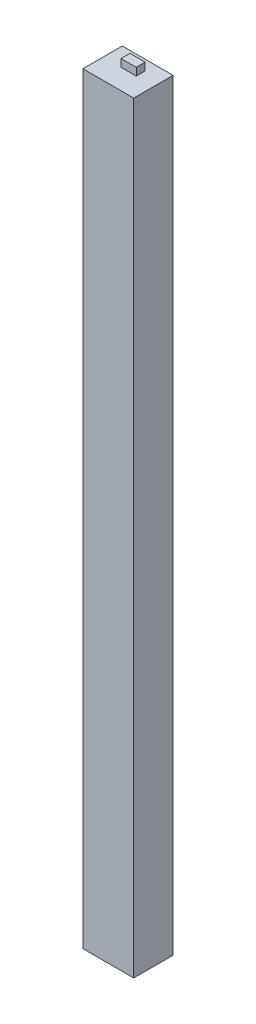
ISO-10303-21;
HEADER;
FILE_DESCRIPTION(('STEP AP214'),'2;1');
FILE_NAME('part.step','',(''),(''),'','','');
FILE_SCHEMA(('AUTOMOTIVE_DESIGN { 1 0 10303 214 1 1 1 1 }'));
ENDSEC;
DATA;
#1=APPLICATION_CONTEXT('core data for automotive mechanical design processes');
#2=APPLICATION_PROTOCOL_DEFINITION('international standard','automotive_design',2000,#1);
#3=PRODUCT_CONTEXT('',#1,'mechanical');
#4=PRODUCT('Part','Part','',(#3));
#5=PRODUCT_RELATED_PRODUCT_CATEGORY('part','',(#4));
#6=PRODUCT_DEFINITION_FORMATION('','',#4);
#7=PRODUCT_DEFINITION_CONTEXT('part definition',#1,'design');
#8=PRODUCT_DEFINITION('design','',#6,#7);
#9=PRODUCT_DEFINITION_SHAPE('','',#8);
#10=(LENGTH_UNIT() NAMED_UNIT(*) SI_UNIT(.MILLI.,.METRE.));
#11=(NAMED_UNIT(*) PLANE_ANGLE_UNIT() SI_UNIT($,.RADIAN.));
#12=(NAMED_UNIT(*) SI_UNIT($,.STERADIAN.) SOLID_ANGLE_UNIT());
#13=UNCERTAINTY_MEASURE_WITH_UNIT(LENGTH_MEASURE(1.E-05),#10,'distance_accuracy_value','');
#14=(GEOMETRIC_REPRESENTATION_CONTEXT(3) GLOBAL_UNCERTAINTY_ASSIGNED_CONTEXT((#13)) GLOBAL_UNIT_ASSIGNED_CONTEXT((#10,
#11,#12)) REPRESENTATION_CONTEXT('',''));
#15=CARTESIAN_POINT('',(0.,0.,0.));
#16=DIRECTION('',(0.,0.,1.));
#17=DIRECTION('',(1.,0.,0.));
#18=AXIS2_PLACEMENT_3D('',#15,#16,#17);
#19=CARTESIAN_POINT('',(-10.,150.,15.5));
#20=DIRECTION('',(0.,-1.,0.));
#21=DIRECTION('',(0.,0.,-1.));
#22=AXIS2_PLACEMENT_3D('',#19,#20,#21);
#23=PLANE('',#22);
#24=DIRECTION('',(-1.,0.,0.));
#25=VECTOR('',#24,1.);
#26=CARTESIAN_POINT('',(-10.,150.,0.));
#27=LINE('',#26,#25);
#28=CARTESIAN_POINT('',(10.,150.,0.));
#29=VERTEX_POINT('',#28);
#30=CARTESIAN_POINT('',(-10.,150.,0.));
#31=VERTEX_POINT('',#30);
#32=EDGE_CURVE('E123',#29,#31,#27,.T.);
#33=ORIENTED_EDGE('',*,*,#32,.T.);
#34=DIRECTION('',(0.,0.,-1.));
#35=VECTOR('',#34,1.);
#36=CARTESIAN_POINT('',(-10.,150.,15.5));
#37=LINE('',#36,#35);
#38=CARTESIAN_POINT('',(-10.,150.,15.5));
#39=VERTEX_POINT('',#38);
#40=EDGE_CURVE('E43',#39,#31,#37,.T.);
#41=ORIENTED_EDGE('',*,*,#40,.F.);
#42=DIRECTION('',(-1.,0.,0.));
#43=VECTOR('',#42,1.);
#44=CARTESIAN_POINT('',(-10.,150.,15.5));
#45=LINE('',#44,#43);
#46=CARTESIAN_POINT('',(10.,150.,15.5));
#47=VERTEX_POINT('',#46);
#48=EDGE_CURVE('E132',#47,#39,#45,.T.);
#49=ORIENTED_EDGE('',*,*,#48,.F.);
#50=DIRECTION('',(0.,0.,-1.));
#51=VECTOR('',#50,1.);
#52=CARTESIAN_POINT('',(10.,150.,15.5));
#53=LINE('',#52,#51);
#54=EDGE_CURVE('E11',#47,#29,#53,.T.);
#55=ORIENTED_EDGE('',*,*,#54,.T.);
#56=EDGE_LOOP('',(#33,#41,#49,#55));
#57=FACE_BOUND('',#56,.T.);
#58=DIRECTION('',(0.,0.,-1.));
#59=VECTOR('',#58,1.);
#60=CARTESIAN_POINT('',(3.,150.,4.));
#61=LINE('',#60,#59);
#62=CARTESIAN_POINT('',(3.,150.,7.5));
#63=VERTEX_POINT('',#62);
#64=CARTESIAN_POINT('',(3.,150.,4.));
#65=VERTEX_POINT('',#64);
#66=EDGE_CURVE('E50',#63,#65,#61,.T.);
#67=ORIENTED_EDGE('',*,*,#66,.F.);
#68=DIRECTION('',(1.,0.,0.));
#69=VECTOR('',#68,1.);
#70=CARTESIAN_POINT('',(-3.,150.,7.5));
#71=LINE('',#70,#69);
#72=CARTESIAN_POINT('',(-3.,150.,7.5));
#73=VERTEX_POINT('',#72);
#74=EDGE_CURVE('E54',#73,#63,#71,.T.);
#75=ORIENTED_EDGE('',*,*,#74,.F.);
#76=DIRECTION('',(0.,0.,1.));
#77=VECTOR('',#76,1.);
#78=CARTESIAN_POINT('',(-3.,150.,4.));
#79=LINE('',#78,#77);
#80=CARTESIAN_POINT('',(-3.,150.,4.));
#81=VERTEX_POINT('',#80);
#82=EDGE_CURVE('E262',#81,#73,#79,.T.);
#83=ORIENTED_EDGE('',*,*,#82,.F.);
#84=DIRECTION('',(-1.,0.,0.));
#85=VECTOR('',#84,1.);
#86=CARTESIAN_POINT('',(-3.,150.,4.));
#87=LINE('',#86,#85);
#88=EDGE_CURVE('E268',#65,#81,#87,.T.);
#89=ORIENTED_EDGE('',*,*,#88,.F.);
#90=EDGE_LOOP('',(#67,#75,#83,#89));
#91=FACE_BOUND('',#90,.T.);
#92=ADVANCED_FACE('F35',(#57,#91),#23,.F.);
#93=CARTESIAN_POINT('',(10.,150.,15.5));
#94=DIRECTION('',(-1.,0.,0.));
#95=DIRECTION('',(0.,-1.,0.));
#96=AXIS2_PLACEMENT_3D('',#93,#94,#95);
#97=PLANE('',#96);
#98=DIRECTION('',(0.,1.,0.));
#99=VECTOR('',#98,1.);
#100=CARTESIAN_POINT('',(10.,150.,0.));
#101=LINE('',#100,#99);
#102=CARTESIAN_POINT('',(10.,-150.,0.));
#103=VERTEX_POINT('',#102);
#104=EDGE_CURVE('E120',#103,#29,#101,.T.);
#105=ORIENTED_EDGE('',*,*,#104,.T.);
#106=ORIENTED_EDGE('',*,*,#54,.F.);
#107=DIRECTION('',(0.,1.,0.));
#108=VECTOR('',#107,1.);
#109=CARTESIAN_POINT('',(10.,150.,15.5));
#110=LINE('',#109,#108);
#111=CARTESIAN_POINT('',(10.,-150.,15.5));
#112=VERTEX_POINT('',#111);
#113=EDGE_CURVE('E129',#112,#47,#110,.T.);
#114=ORIENTED_EDGE('',*,*,#113,.F.);
#115=DIRECTION('',(0.,0.,-1.));
#116=VECTOR('',#115,1.);
#117=CARTESIAN_POINT('',(10.,-150.,15.5));
#118=LINE('',#117,#116);
#119=EDGE_CURVE('E138',#112,#103,#118,.T.);
#120=ORIENTED_EDGE('',*,*,#119,.T.);
#121=EDGE_LOOP('',(#105,#106,#114,#120));
#122=FACE_BOUND('',#121,.T.);
#123=ADVANCED_FACE('F37',(#122),#97,.F.);
#124=CARTESIAN_POINT('',(-10.,150.,15.5));
#125=DIRECTION('',(1.,0.,0.));
#126=DIRECTION('',(0.,1.,0.));
#127=AXIS2_PLACEMENT_3D('',#124,#125,#126);
#128=PLANE('',#127);
#129=DIRECTION('',(0.,-1.,0.));
#130=VECTOR('',#129,1.);
#131=CARTESIAN_POINT('',(-10.,150.,0.));
#132=LINE('',#131,#130);
#133=CARTESIAN_POINT('',(-9.99999999999997,-150.,0.));
#134=VERTEX_POINT('',#133);
#135=EDGE_CURVE('E141',#31,#134,#132,.T.);
#136=ORIENTED_EDGE('',*,*,#135,.T.);
#137=DIRECTION('',(0.,0.,-1.));
#138=VECTOR('',#137,1.);
#139=CARTESIAN_POINT('',(-9.99999999999997,-150.,15.5));
#140=LINE('',#139,#138);
#141=CARTESIAN_POINT('',(-9.99999999999997,-150.,15.5));
#142=VERTEX_POINT('',#141);
#143=EDGE_CURVE('E146',#142,#134,#140,.T.);
#144=ORIENTED_EDGE('',*,*,#143,.F.);
#145=DIRECTION('',(0.,-1.,0.));
#146=VECTOR('',#145,1.);
#147=CARTESIAN_POINT('',(-10.,150.,15.5));
#148=LINE('',#147,#146);
#149=EDGE_CURVE('E135',#39,#142,#148,.T.);
#150=ORIENTED_EDGE('',*,*,#149,.F.);
#151=ORIENTED_EDGE('',*,*,#40,.T.);
#152=EDGE_LOOP('',(#136,#144,#150,#151));
#153=FACE_BOUND('',#152,.T.);
#154=ADVANCED_FACE('F153',(#153),#128,.F.);
#155=CARTESIAN_POINT('',(-9.99999999999997,-150.,15.5));
#156=DIRECTION('',(0.,1.,0.));
#157=DIRECTION('',(0.,0.,1.));
#158=AXIS2_PLACEMENT_3D('',#155,#156,#157);
#159=PLANE('',#158);
#160=DIRECTION('',(1.,0.,0.));
#161=VECTOR('',#160,1.);
#162=CARTESIAN_POINT('',(-9.99999999999997,-150.,0.));
#163=LINE('',#162,#161);
#164=EDGE_CURVE('E133',#134,#103,#163,.T.);
#165=ORIENTED_EDGE('',*,*,#164,.T.);
#166=ORIENTED_EDGE('',*,*,#119,.F.);
#167=DIRECTION('',(1.,0.,0.));
#168=VECTOR('',#167,1.);
#169=CARTESIAN_POINT('',(-9.99999999999997,-150.,15.5));
#170=LINE('',#169,#168);
#171=EDGE_CURVE('E137',#142,#112,#170,.T.);
#172=ORIENTED_EDGE('',*,*,#171,.F.);
#173=ORIENTED_EDGE('',*,*,#143,.T.);
#174=EDGE_LOOP('',(#165,#166,#172,#173));
#175=FACE_BOUND('',#174,.T.);
#176=ADVANCED_FACE('F162',(#175),#159,.F.);
#177=CARTESIAN_POINT('',(0.,0.,15.5));
#178=DIRECTION('',(0.,0.,1.));
#179=DIRECTION('',(1.,0.,0.));
#180=AXIS2_PLACEMENT_3D('',#177,#178,#179);
#181=PLANE('',#180);
#182=ORIENTED_EDGE('',*,*,#113,.T.);
#183=ORIENTED_EDGE('',*,*,#48,.T.);
#184=ORIENTED_EDGE('',*,*,#149,.T.);
#185=ORIENTED_EDGE('',*,*,#171,.T.);
#186=EDGE_LOOP('',(#182,#183,#184,#185));
#187=FACE_BOUND('',#186,.T.);
#188=ADVANCED_FACE('F168',(#187),#181,.T.);
#189=CARTESIAN_POINT('',(0.,0.,0.));
#190=DIRECTION('',(0.,0.,1.));
#191=DIRECTION('',(1.,0.,0.));
#192=AXIS2_PLACEMENT_3D('',#189,#190,#191);
#193=PLANE('',#192);
#194=ORIENTED_EDGE('',*,*,#104,.F.);
#195=ORIENTED_EDGE('',*,*,#164,.F.);
#196=ORIENTED_EDGE('',*,*,#135,.F.);
#197=ORIENTED_EDGE('',*,*,#32,.F.);
#198=EDGE_LOOP('',(#194,#195,#196,#197));
#199=FACE_BOUND('',#198,.T.);
#200=ADVANCED_FACE('F159',(#199),#193,.F.);
#201=CARTESIAN_POINT('',(3.,153.,4.));
#202=DIRECTION('',(-1.,0.,0.));
#203=DIRECTION('',(0.,0.,1.));
#204=AXIS2_PLACEMENT_3D('',#201,#202,#203);
#205=PLANE('',#204);
#206=ORIENTED_EDGE('',*,*,#66,.T.);
#207=DIRECTION('',(0.,-1.,0.));
#208=VECTOR('',#207,1.);
#209=CARTESIAN_POINT('',(3.,153.,4.));
#210=LINE('',#209,#208);
#211=CARTESIAN_POINT('',(3.,153.,4.));
#212=VERTEX_POINT('',#211);
#213=EDGE_CURVE('E103',#212,#65,#210,.T.);
#214=ORIENTED_EDGE('',*,*,#213,.F.);
#215=DIRECTION('',(0.,0.,-1.));
#216=VECTOR('',#215,1.);
#217=CARTESIAN_POINT('',(3.,153.,4.));
#218=LINE('',#217,#216);
#219=CARTESIAN_POINT('',(3.,153.,7.5));
#220=VERTEX_POINT('',#219);
#221=EDGE_CURVE('E109',#220,#212,#218,.T.);
#222=ORIENTED_EDGE('',*,*,#221,.F.);
#223=DIRECTION('',(0.,-1.,0.));
#224=VECTOR('',#223,1.);
#225=CARTESIAN_POINT('',(3.,153.,7.5));
#226=LINE('',#225,#224);
#227=EDGE_CURVE('E260',#220,#63,#226,.T.);
#228=ORIENTED_EDGE('',*,*,#227,.T.);
#229=EDGE_LOOP('',(#206,#214,#222,#228));
#230=FACE_BOUND('',#229,.T.);
#231=ADVANCED_FACE('F119',(#230),#205,.F.);
#232=CARTESIAN_POINT('',(-3.,153.,4.));
#233=DIRECTION('',(0.,0.,1.));
#234=DIRECTION('',(1.,0.,0.));
#235=AXIS2_PLACEMENT_3D('',#232,#233,#234);
#236=PLANE('',#235);
#237=ORIENTED_EDGE('',*,*,#88,.T.);
#238=DIRECTION('',(0.,-1.,0.));
#239=VECTOR('',#238,1.);
#240=CARTESIAN_POINT('',(-3.,153.,4.));
#241=LINE('',#240,#239);
#242=CARTESIAN_POINT('',(-3.,153.,4.));
#243=VERTEX_POINT('',#242);
#244=EDGE_CURVE('E105',#243,#81,#241,.T.);
#245=ORIENTED_EDGE('',*,*,#244,.F.);
#246=DIRECTION('',(-1.,0.,0.));
#247=VECTOR('',#246,1.);
#248=CARTESIAN_POINT('',(-3.,153.,4.));
#249=LINE('',#248,#247);
#250=EDGE_CURVE('E98',#212,#243,#249,.T.);
#251=ORIENTED_EDGE('',*,*,#250,.F.);
#252=ORIENTED_EDGE('',*,*,#213,.T.);
#253=EDGE_LOOP('',(#237,#245,#251,#252));
#254=FACE_BOUND('',#253,.T.);
#255=ADVANCED_FACE('F101',(#254),#236,.F.);
#256=CARTESIAN_POINT('',(-3.,153.,4.));
#257=DIRECTION('',(1.,0.,0.));
#258=DIRECTION('',(0.,0.,-1.));
#259=AXIS2_PLACEMENT_3D('',#256,#257,#258);
#260=PLANE('',#259);
#261=ORIENTED_EDGE('',*,*,#82,.T.);
#262=DIRECTION('',(0.,-1.,0.));
#263=VECTOR('',#262,1.);
#264=CARTESIAN_POINT('',(-3.,153.,7.5));
#265=LINE('',#264,#263);
#266=CARTESIAN_POINT('',(-3.,153.,7.5));
#267=VERTEX_POINT('',#266);
#268=EDGE_CURVE('E125',#267,#73,#265,.T.);
#269=ORIENTED_EDGE('',*,*,#268,.F.);
#270=DIRECTION('',(0.,0.,1.));
#271=VECTOR('',#270,1.);
#272=CARTESIAN_POINT('',(-3.,153.,4.));
#273=LINE('',#272,#271);
#274=EDGE_CURVE('E108',#243,#267,#273,.T.);
#275=ORIENTED_EDGE('',*,*,#274,.F.);
#276=ORIENTED_EDGE('',*,*,#244,.T.);
#277=EDGE_LOOP('',(#261,#269,#275,#276));
#278=FACE_BOUND('',#277,.T.);
#279=ADVANCED_FACE('F186',(#278),#260,.F.);
#280=CARTESIAN_POINT('',(-3.,153.,7.5));
#281=DIRECTION('',(0.,0.,-1.));
#282=DIRECTION('',(-1.,0.,0.));
#283=AXIS2_PLACEMENT_3D('',#280,#281,#282);
#284=PLANE('',#283);
#285=ORIENTED_EDGE('',*,*,#74,.T.);
#286=ORIENTED_EDGE('',*,*,#227,.F.);
#287=DIRECTION('',(1.,0.,0.));
#288=VECTOR('',#287,1.);
#289=CARTESIAN_POINT('',(-3.,153.,7.5));
#290=LINE('',#289,#288);
#291=EDGE_CURVE('E114',#267,#220,#290,.T.);
#292=ORIENTED_EDGE('',*,*,#291,.F.);
#293=ORIENTED_EDGE('',*,*,#268,.T.);
#294=EDGE_LOOP('',(#285,#286,#292,#293));
#295=FACE_BOUND('',#294,.T.);
#296=ADVANCED_FACE('F189',(#295),#284,.F.);
#297=CARTESIAN_POINT('',(0.,153.,0.));
#298=DIRECTION('',(0.,1.,0.));
#299=DIRECTION('',(0.,0.,1.));
#300=AXIS2_PLACEMENT_3D('',#297,#298,#299);
#301=PLANE('',#300);
#302=ORIENTED_EDGE('',*,*,#221,.T.);
#303=ORIENTED_EDGE('',*,*,#250,.T.);
#304=ORIENTED_EDGE('',*,*,#274,.T.);
#305=ORIENTED_EDGE('',*,*,#291,.T.);
#306=EDGE_LOOP('',(#302,#303,#304,#305));
#307=FACE_BOUND('',#306,.T.);
#308=ADVANCED_FACE('F112',(#307),#301,.T.);
#309=CLOSED_SHELL('',(#92,#123,#154,#176,#188,#200,#231,#255,#279,#296,#308));
#310=MANIFOLD_SOLID_BREP('B2',#309);
#311=ADVANCED_BREP_SHAPE_REPRESENTATION('',(#18,#310),#14);
#312=SHAPE_DEFINITION_REPRESENTATION(#9,#311);
ENDSEC;
END-ISO-10303-21;
